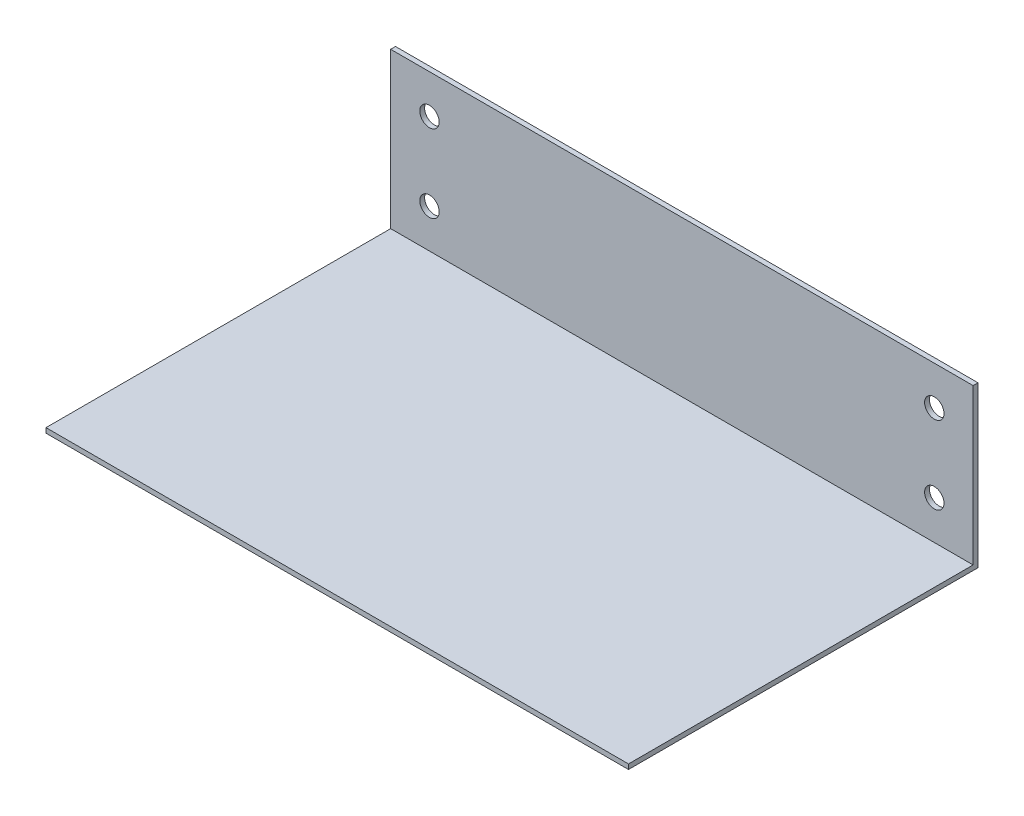
ISO-10303-21;
HEADER;
FILE_DESCRIPTION(('STEP AP214'),'2;1');
FILE_NAME('part.step','',(''),(''),'','','');
FILE_SCHEMA(('AUTOMOTIVE_DESIGN { 1 0 10303 214 1 1 1 1 }'));
ENDSEC;
DATA;
#1=APPLICATION_CONTEXT('core data for automotive mechanical design processes');
#2=APPLICATION_PROTOCOL_DEFINITION('international standard','automotive_design',2000,#1);
#3=PRODUCT_CONTEXT('',#1,'mechanical');
#4=PRODUCT('Part','Part','',(#3));
#5=PRODUCT_RELATED_PRODUCT_CATEGORY('part','',(#4));
#6=PRODUCT_DEFINITION_FORMATION('','',#4);
#7=PRODUCT_DEFINITION_CONTEXT('part definition',#1,'design');
#8=PRODUCT_DEFINITION('design','',#6,#7);
#9=PRODUCT_DEFINITION_SHAPE('','',#8);
#10=(LENGTH_UNIT() NAMED_UNIT(*) SI_UNIT(.MILLI.,.METRE.));
#11=(NAMED_UNIT(*) PLANE_ANGLE_UNIT() SI_UNIT($,.RADIAN.));
#12=(NAMED_UNIT(*) SI_UNIT($,.STERADIAN.) SOLID_ANGLE_UNIT());
#13=UNCERTAINTY_MEASURE_WITH_UNIT(LENGTH_MEASURE(1.E-05),#10,'distance_accuracy_value','');
#14=(GEOMETRIC_REPRESENTATION_CONTEXT(3) GLOBAL_UNCERTAINTY_ASSIGNED_CONTEXT((#13)) GLOBAL_UNIT_ASSIGNED_CONTEXT((#10,
#11,#12)) REPRESENTATION_CONTEXT('',''));
#15=CARTESIAN_POINT('',(0.,0.,0.));
#16=DIRECTION('',(0.,0.,1.));
#17=DIRECTION('',(1.,0.,0.));
#18=AXIS2_PLACEMENT_3D('',#15,#16,#17);
#19=CARTESIAN_POINT('',(381.,3.175,0.));
#20=DIRECTION('',(0.,1.,0.));
#21=DIRECTION('',(0.,0.,1.));
#22=AXIS2_PLACEMENT_3D('',#19,#20,#21);
#23=PLANE('',#22);
#24=DIRECTION('',(0.,0.,-1.));
#25=VECTOR('',#24,1.);
#26=CARTESIAN_POINT('',(381.,3.175,0.));
#27=LINE('',#26,#25);
#28=CARTESIAN_POINT('',(381.,3.175,3.175));
#29=VERTEX_POINT('',#28);
#30=CARTESIAN_POINT('',(381.,3.175,228.6));
#31=VERTEX_POINT('',#30);
#32=EDGE_CURVE('E85',#29,#31,#27,.F.);
#33=ORIENTED_EDGE('',*,*,#32,.F.);
#34=DIRECTION('',(1.,0.,0.));
#35=VECTOR('',#34,1.);
#36=CARTESIAN_POINT('',(0.,3.175,3.175));
#37=LINE('',#36,#35);
#38=CARTESIAN_POINT('',(0.,3.175,3.175));
#39=VERTEX_POINT('',#38);
#40=EDGE_CURVE('E68',#39,#29,#37,.T.);
#41=ORIENTED_EDGE('',*,*,#40,.F.);
#42=DIRECTION('',(0.,0.,1.));
#43=VECTOR('',#42,1.);
#44=CARTESIAN_POINT('',(0.,3.175,0.));
#45=LINE('',#44,#43);
#46=CARTESIAN_POINT('',(0.,3.175,228.6));
#47=VERTEX_POINT('',#46);
#48=EDGE_CURVE('E146',#47,#39,#45,.F.);
#49=ORIENTED_EDGE('',*,*,#48,.F.);
#50=DIRECTION('',(1.,0.,0.));
#51=VECTOR('',#50,1.);
#52=CARTESIAN_POINT('',(0.,3.175,228.6));
#53=LINE('',#52,#51);
#54=EDGE_CURVE('E152',#31,#47,#53,.F.);
#55=ORIENTED_EDGE('',*,*,#54,.F.);
#56=EDGE_LOOP('',(#33,#41,#49,#55));
#57=FACE_BOUND('',#56,.T.);
#58=ADVANCED_FACE('F17',(#57),#23,.T.);
#59=CARTESIAN_POINT('',(0.,3.175,3.175));
#60=DIRECTION('',(0.,0.,1.));
#61=DIRECTION('',(1.,0.,0.));
#62=AXIS2_PLACEMENT_3D('',#59,#60,#61);
#63=PLANE('',#62);
#64=CARTESIAN_POINT('',(355.6,28.575,3.175));
#65=DIRECTION('',(0.,0.,1.));
#66=DIRECTION('',(1.,0.,0.));
#67=AXIS2_PLACEMENT_3D('',#64,#65,#66);
#68=CIRCLE('',#67,6.35);
#69=CARTESIAN_POINT('',(361.95,28.575,3.175));
#70=VERTEX_POINT('',#69);
#71=EDGE_CURVE('E91',#70,#70,#68,.F.);
#72=ORIENTED_EDGE('',*,*,#71,.T.);
#73=EDGE_LOOP('',(#72));
#74=FACE_BOUND('',#73,.T.);
#75=CARTESIAN_POINT('',(355.6,79.375,3.175));
#76=DIRECTION('',(0.,0.,1.));
#77=DIRECTION('',(1.,0.,0.));
#78=AXIS2_PLACEMENT_3D('',#75,#76,#77);
#79=CIRCLE('',#78,6.35);
#80=CARTESIAN_POINT('',(361.95,79.375,3.175));
#81=VERTEX_POINT('',#80);
#82=EDGE_CURVE('E94',#81,#81,#79,.F.);
#83=ORIENTED_EDGE('',*,*,#82,.T.);
#84=EDGE_LOOP('',(#83));
#85=FACE_BOUND('',#84,.T.);
#86=CARTESIAN_POINT('',(25.4,28.575,3.175));
#87=DIRECTION('',(0.,0.,1.));
#88=DIRECTION('',(1.,0.,0.));
#89=AXIS2_PLACEMENT_3D('',#86,#87,#88);
#90=CIRCLE('',#89,6.35);
#91=CARTESIAN_POINT('',(31.75,28.575,3.175));
#92=VERTEX_POINT('',#91);
#93=EDGE_CURVE('E113',#92,#92,#90,.F.);
#94=ORIENTED_EDGE('',*,*,#93,.T.);
#95=EDGE_LOOP('',(#94));
#96=FACE_BOUND('',#95,.T.);
#97=CARTESIAN_POINT('',(25.4,79.375,3.175));
#98=DIRECTION('',(0.,0.,1.));
#99=DIRECTION('',(1.,0.,0.));
#100=AXIS2_PLACEMENT_3D('',#97,#98,#99);
#101=CIRCLE('',#100,6.35);
#102=CARTESIAN_POINT('',(31.75,79.375,3.175));
#103=VERTEX_POINT('',#102);
#104=EDGE_CURVE('E20',#103,#103,#101,.F.);
#105=ORIENTED_EDGE('',*,*,#104,.T.);
#106=EDGE_LOOP('',(#105));
#107=FACE_BOUND('',#106,.T.);
#108=DIRECTION('',(0.,1.,0.));
#109=VECTOR('',#108,1.);
#110=CARTESIAN_POINT('',(0.,3.175,3.175));
#111=LINE('',#110,#109);
#112=CARTESIAN_POINT('',(0.,104.775,3.175));
#113=VERTEX_POINT('',#112);
#114=EDGE_CURVE('E144',#39,#113,#111,.T.);
#115=ORIENTED_EDGE('',*,*,#114,.F.);
#116=ORIENTED_EDGE('',*,*,#40,.T.);
#117=DIRECTION('',(0.,1.,0.));
#118=VECTOR('',#117,1.);
#119=CARTESIAN_POINT('',(381.,0.,3.175));
#120=LINE('',#119,#118);
#121=CARTESIAN_POINT('',(381.,104.775,3.175));
#122=VERTEX_POINT('',#121);
#123=EDGE_CURVE('E82',#122,#29,#120,.F.);
#124=ORIENTED_EDGE('',*,*,#123,.F.);
#125=DIRECTION('',(1.,0.,0.));
#126=VECTOR('',#125,1.);
#127=CARTESIAN_POINT('',(0.,104.775,3.175));
#128=LINE('',#127,#126);
#129=EDGE_CURVE('E73',#113,#122,#128,.T.);
#130=ORIENTED_EDGE('',*,*,#129,.F.);
#131=EDGE_LOOP('',(#115,#116,#124,#130));
#132=FACE_BOUND('',#131,.T.);
#133=ADVANCED_FACE('F83',(#74,#85,#96,#107,#132),#63,.T.);
#134=CARTESIAN_POINT('',(0.,104.775,0.));
#135=DIRECTION('',(0.,1.,0.));
#136=DIRECTION('',(0.,0.,1.));
#137=AXIS2_PLACEMENT_3D('',#134,#135,#136);
#138=PLANE('',#137);
#139=DIRECTION('',(0.,0.,-1.));
#140=VECTOR('',#139,1.);
#141=CARTESIAN_POINT('',(381.,104.775,0.));
#142=LINE('',#141,#140);
#143=CARTESIAN_POINT('',(381.,104.775,0.));
#144=VERTEX_POINT('',#143);
#145=EDGE_CURVE('E76',#144,#122,#142,.F.);
#146=ORIENTED_EDGE('',*,*,#145,.F.);
#147=DIRECTION('',(1.,0.,0.));
#148=VECTOR('',#147,1.);
#149=CARTESIAN_POINT('',(0.,104.775,0.));
#150=LINE('',#149,#148);
#151=CARTESIAN_POINT('',(0.,104.775,0.));
#152=VERTEX_POINT('',#151);
#153=EDGE_CURVE('E135',#144,#152,#150,.F.);
#154=ORIENTED_EDGE('',*,*,#153,.T.);
#155=DIRECTION('',(0.,0.,1.));
#156=VECTOR('',#155,1.);
#157=CARTESIAN_POINT('',(0.,104.775,0.));
#158=LINE('',#157,#156);
#159=EDGE_CURVE('E78',#113,#152,#158,.F.);
#160=ORIENTED_EDGE('',*,*,#159,.F.);
#161=ORIENTED_EDGE('',*,*,#129,.T.);
#162=EDGE_LOOP('',(#146,#154,#160,#161));
#163=FACE_BOUND('',#162,.T.);
#164=ADVANCED_FACE('F74',(#163),#138,.T.);
#165=CARTESIAN_POINT('',(25.4,79.375,3.175));
#166=DIRECTION('',(0.,0.,1.));
#167=DIRECTION('',(1.,0.,0.));
#168=AXIS2_PLACEMENT_3D('',#165,#166,#167);
#169=CYLINDRICAL_SURFACE('',#168,6.35);
#170=ORIENTED_EDGE('',*,*,#104,.F.);
#171=EDGE_LOOP('',(#170));
#172=FACE_BOUND('',#171,.T.);
#173=CARTESIAN_POINT('',(25.4,79.375,0.));
#174=DIRECTION('',(0.,0.,1.));
#175=DIRECTION('',(1.,0.,0.));
#176=AXIS2_PLACEMENT_3D('',#173,#174,#175);
#177=CIRCLE('',#176,6.35);
#178=CARTESIAN_POINT('',(31.75,79.375,0.));
#179=VERTEX_POINT('',#178);
#180=EDGE_CURVE('E109',#179,#179,#177,.F.);
#181=ORIENTED_EDGE('',*,*,#180,.T.);
#182=EDGE_LOOP('',(#181));
#183=FACE_BOUND('',#182,.T.);
#184=ADVANCED_FACE('F121',(#172,#183),#169,.F.);
#185=CARTESIAN_POINT('',(25.4,28.575,3.175));
#186=DIRECTION('',(0.,0.,1.));
#187=DIRECTION('',(1.,0.,0.));
#188=AXIS2_PLACEMENT_3D('',#185,#186,#187);
#189=CYLINDRICAL_SURFACE('',#188,6.35);
#190=ORIENTED_EDGE('',*,*,#93,.F.);
#191=EDGE_LOOP('',(#190));
#192=FACE_BOUND('',#191,.T.);
#193=CARTESIAN_POINT('',(25.4,28.575,0.));
#194=DIRECTION('',(0.,0.,1.));
#195=DIRECTION('',(1.,0.,0.));
#196=AXIS2_PLACEMENT_3D('',#193,#194,#195);
#197=CIRCLE('',#196,6.35);
#198=CARTESIAN_POINT('',(31.75,28.575,0.));
#199=VERTEX_POINT('',#198);
#200=EDGE_CURVE('E106',#199,#199,#197,.F.);
#201=ORIENTED_EDGE('',*,*,#200,.T.);
#202=EDGE_LOOP('',(#201));
#203=FACE_BOUND('',#202,.T.);
#204=ADVANCED_FACE('F124',(#192,#203),#189,.F.);
#205=CARTESIAN_POINT('',(355.6,79.375,3.175));
#206=DIRECTION('',(0.,0.,1.));
#207=DIRECTION('',(1.,0.,0.));
#208=AXIS2_PLACEMENT_3D('',#205,#206,#207);
#209=CYLINDRICAL_SURFACE('',#208,6.35);
#210=ORIENTED_EDGE('',*,*,#82,.F.);
#211=EDGE_LOOP('',(#210));
#212=FACE_BOUND('',#211,.T.);
#213=CARTESIAN_POINT('',(355.6,79.375,0.));
#214=DIRECTION('',(0.,0.,1.));
#215=DIRECTION('',(1.,0.,0.));
#216=AXIS2_PLACEMENT_3D('',#213,#214,#215);
#217=CIRCLE('',#216,6.35);
#218=CARTESIAN_POINT('',(361.95,79.375,0.));
#219=VERTEX_POINT('',#218);
#220=EDGE_CURVE('E103',#219,#219,#217,.F.);
#221=ORIENTED_EDGE('',*,*,#220,.T.);
#222=EDGE_LOOP('',(#221));
#223=FACE_BOUND('',#222,.T.);
#224=ADVANCED_FACE('F219',(#212,#223),#209,.F.);
#225=CARTESIAN_POINT('',(355.6,28.575,3.175));
#226=DIRECTION('',(0.,0.,1.));
#227=DIRECTION('',(1.,0.,0.));
#228=AXIS2_PLACEMENT_3D('',#225,#226,#227);
#229=CYLINDRICAL_SURFACE('',#228,6.35);
#230=ORIENTED_EDGE('',*,*,#71,.F.);
#231=EDGE_LOOP('',(#230));
#232=FACE_BOUND('',#231,.T.);
#233=CARTESIAN_POINT('',(355.6,28.575,0.));
#234=DIRECTION('',(0.,0.,1.));
#235=DIRECTION('',(1.,0.,0.));
#236=AXIS2_PLACEMENT_3D('',#233,#234,#235);
#237=CIRCLE('',#236,6.35);
#238=CARTESIAN_POINT('',(361.95,28.575,0.));
#239=VERTEX_POINT('',#238);
#240=EDGE_CURVE('E99',#239,#239,#237,.F.);
#241=ORIENTED_EDGE('',*,*,#240,.T.);
#242=EDGE_LOOP('',(#241));
#243=FACE_BOUND('',#242,.T.);
#244=ADVANCED_FACE('F209',(#232,#243),#229,.F.);
#245=CARTESIAN_POINT('',(381.,0.,0.));
#246=DIRECTION('',(1.,0.,0.));
#247=DIRECTION('',(0.,0.,-1.));
#248=AXIS2_PLACEMENT_3D('',#245,#246,#247);
#249=PLANE('',#248);
#250=ORIENTED_EDGE('',*,*,#123,.T.);
#251=ORIENTED_EDGE('',*,*,#32,.T.);
#252=DIRECTION('',(0.,1.,0.));
#253=VECTOR('',#252,1.);
#254=CARTESIAN_POINT('',(381.,0.,228.6));
#255=LINE('',#254,#253);
#256=CARTESIAN_POINT('',(381.,0.,228.6));
#257=VERTEX_POINT('',#256);
#258=EDGE_CURVE('E154',#257,#31,#255,.T.);
#259=ORIENTED_EDGE('',*,*,#258,.F.);
#260=DIRECTION('',(0.,0.,-1.));
#261=VECTOR('',#260,1.);
#262=CARTESIAN_POINT('',(381.,0.,0.));
#263=LINE('',#262,#261);
#264=CARTESIAN_POINT('',(381.,0.,0.));
#265=VERTEX_POINT('',#264);
#266=EDGE_CURVE('E102',#265,#257,#263,.F.);
#267=ORIENTED_EDGE('',*,*,#266,.F.);
#268=DIRECTION('',(0.,1.,0.));
#269=VECTOR('',#268,1.);
#270=CARTESIAN_POINT('',(381.,0.,0.));
#271=LINE('',#270,#269);
#272=EDGE_CURVE('E89',#265,#144,#271,.T.);
#273=ORIENTED_EDGE('',*,*,#272,.T.);
#274=ORIENTED_EDGE('',*,*,#145,.T.);
#275=EDGE_LOOP('',(#250,#251,#259,#267,#273,#274));
#276=FACE_BOUND('',#275,.T.);
#277=ADVANCED_FACE('F87',(#276),#249,.T.);
#278=CARTESIAN_POINT('',(0.,0.,228.6));
#279=DIRECTION('',(0.,0.,1.));
#280=DIRECTION('',(1.,0.,0.));
#281=AXIS2_PLACEMENT_3D('',#278,#279,#280);
#282=PLANE('',#281);
#283=DIRECTION('',(0.,1.,0.));
#284=VECTOR('',#283,1.);
#285=CARTESIAN_POINT('',(0.,3.175,228.6));
#286=LINE('',#285,#284);
#287=CARTESIAN_POINT('',(0.,0.,228.6));
#288=VERTEX_POINT('',#287);
#289=EDGE_CURVE('E149',#288,#47,#286,.T.);
#290=ORIENTED_EDGE('',*,*,#289,.F.);
#291=DIRECTION('',(1.,0.,0.));
#292=VECTOR('',#291,1.);
#293=CARTESIAN_POINT('',(0.,0.,228.6));
#294=LINE('',#293,#292);
#295=EDGE_CURVE('E163',#257,#288,#294,.F.);
#296=ORIENTED_EDGE('',*,*,#295,.F.);
#297=ORIENTED_EDGE('',*,*,#258,.T.);
#298=ORIENTED_EDGE('',*,*,#54,.T.);
#299=EDGE_LOOP('',(#290,#296,#297,#298));
#300=FACE_BOUND('',#299,.T.);
#301=ADVANCED_FACE('F161',(#300),#282,.T.);
#302=CARTESIAN_POINT('',(0.,3.175,0.));
#303=DIRECTION('',(-1.,0.,0.));
#304=DIRECTION('',(0.,0.,1.));
#305=AXIS2_PLACEMENT_3D('',#302,#303,#304);
#306=PLANE('',#305);
#307=ORIENTED_EDGE('',*,*,#159,.T.);
#308=DIRECTION('',(0.,1.,0.));
#309=VECTOR('',#308,1.);
#310=CARTESIAN_POINT('',(0.,0.,0.));
#311=LINE('',#310,#309);
#312=CARTESIAN_POINT('',(0.,0.,0.));
#313=VERTEX_POINT('',#312);
#314=EDGE_CURVE('E35',#152,#313,#311,.F.);
#315=ORIENTED_EDGE('',*,*,#314,.T.);
#316=DIRECTION('',(0.,0.,-1.));
#317=VECTOR('',#316,1.);
#318=CARTESIAN_POINT('',(0.,0.,0.));
#319=LINE('',#318,#317);
#320=EDGE_CURVE('E26',#288,#313,#319,.T.);
#321=ORIENTED_EDGE('',*,*,#320,.F.);
#322=ORIENTED_EDGE('',*,*,#289,.T.);
#323=ORIENTED_EDGE('',*,*,#48,.T.);
#324=ORIENTED_EDGE('',*,*,#114,.T.);
#325=EDGE_LOOP('',(#307,#315,#321,#322,#323,#324));
#326=FACE_BOUND('',#325,.T.);
#327=ADVANCED_FACE('F132',(#326),#306,.T.);
#328=CARTESIAN_POINT('',(0.,0.,0.));
#329=DIRECTION('',(0.,0.,1.));
#330=DIRECTION('',(1.,0.,0.));
#331=AXIS2_PLACEMENT_3D('',#328,#329,#330);
#332=PLANE('',#331);
#333=ORIENTED_EDGE('',*,*,#240,.F.);
#334=EDGE_LOOP('',(#333));
#335=FACE_BOUND('',#334,.T.);
#336=ORIENTED_EDGE('',*,*,#220,.F.);
#337=EDGE_LOOP('',(#336));
#338=FACE_BOUND('',#337,.T.);
#339=ORIENTED_EDGE('',*,*,#200,.F.);
#340=EDGE_LOOP('',(#339));
#341=FACE_BOUND('',#340,.T.);
#342=ORIENTED_EDGE('',*,*,#180,.F.);
#343=EDGE_LOOP('',(#342));
#344=FACE_BOUND('',#343,.T.);
#345=ORIENTED_EDGE('',*,*,#314,.F.);
#346=ORIENTED_EDGE('',*,*,#153,.F.);
#347=ORIENTED_EDGE('',*,*,#272,.F.);
#348=DIRECTION('',(1.,0.,0.));
#349=VECTOR('',#348,1.);
#350=CARTESIAN_POINT('',(0.,0.,0.));
#351=LINE('',#350,#349);
#352=EDGE_CURVE('E11',#313,#265,#351,.T.);
#353=ORIENTED_EDGE('',*,*,#352,.F.);
#354=EDGE_LOOP('',(#345,#346,#347,#353));
#355=FACE_BOUND('',#354,.T.);
#356=ADVANCED_FACE('F128',(#335,#338,#341,#344,#355),#332,.F.);
#357=CARTESIAN_POINT('',(0.,0.,0.));
#358=DIRECTION('',(0.,-1.,0.));
#359=DIRECTION('',(0.,0.,-1.));
#360=AXIS2_PLACEMENT_3D('',#357,#358,#359);
#361=PLANE('',#360);
#362=ORIENTED_EDGE('',*,*,#320,.T.);
#363=ORIENTED_EDGE('',*,*,#352,.T.);
#364=ORIENTED_EDGE('',*,*,#266,.T.);
#365=ORIENTED_EDGE('',*,*,#295,.T.);
#366=EDGE_LOOP('',(#362,#363,#364,#365));
#367=FACE_BOUND('',#366,.T.);
#368=ADVANCED_FACE('F131',(#367),#361,.T.);
#369=CLOSED_SHELL('',(#58,#133,#164,#184,#204,#224,#244,#277,#301,#327,#356,#368));
#370=MANIFOLD_SOLID_BREP('B1',#369);
#371=ADVANCED_BREP_SHAPE_REPRESENTATION('',(#18,#370),#14);
#372=SHAPE_DEFINITION_REPRESENTATION(#9,#371);
ENDSEC;
END-ISO-10303-21;
